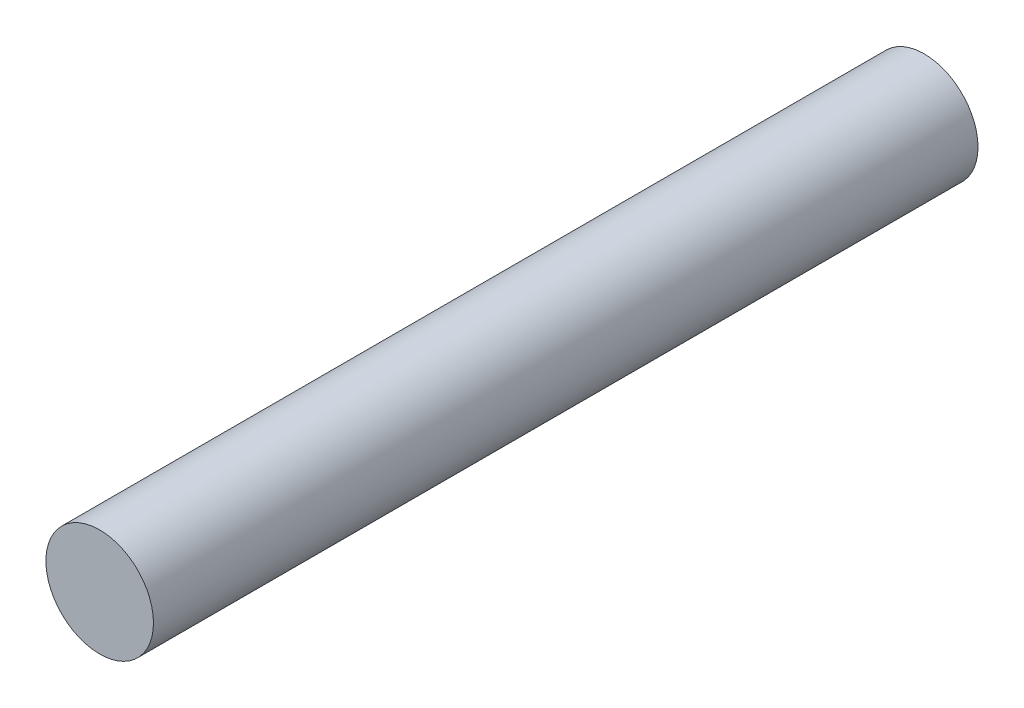
ISO-10303-21;
HEADER;
FILE_DESCRIPTION(('STEP AP214'),'2;1');
FILE_NAME('part.step','',(''),(''),'','','');
FILE_SCHEMA(('AUTOMOTIVE_DESIGN { 1 0 10303 214 1 1 1 1 }'));
ENDSEC;
DATA;
#1=APPLICATION_CONTEXT('core data for automotive mechanical design processes');
#2=APPLICATION_PROTOCOL_DEFINITION('international standard','automotive_design',2000,#1);
#3=PRODUCT_CONTEXT('',#1,'mechanical');
#4=PRODUCT('Part','Part','',(#3));
#5=PRODUCT_RELATED_PRODUCT_CATEGORY('part','',(#4));
#6=PRODUCT_DEFINITION_FORMATION('','',#4);
#7=PRODUCT_DEFINITION_CONTEXT('part definition',#1,'design');
#8=PRODUCT_DEFINITION('design','',#6,#7);
#9=PRODUCT_DEFINITION_SHAPE('','',#8);
#10=(LENGTH_UNIT() NAMED_UNIT(*) SI_UNIT(.MILLI.,.METRE.));
#11=(NAMED_UNIT(*) PLANE_ANGLE_UNIT() SI_UNIT($,.RADIAN.));
#12=(NAMED_UNIT(*) SI_UNIT($,.STERADIAN.) SOLID_ANGLE_UNIT());
#13=UNCERTAINTY_MEASURE_WITH_UNIT(LENGTH_MEASURE(1.E-05),#10,'distance_accuracy_value','');
#14=(GEOMETRIC_REPRESENTATION_CONTEXT(3) GLOBAL_UNCERTAINTY_ASSIGNED_CONTEXT((#13)) GLOBAL_UNIT_ASSIGNED_CONTEXT((#10,
#11,#12)) REPRESENTATION_CONTEXT('',''));
#15=CARTESIAN_POINT('',(0.,0.,0.));
#16=DIRECTION('',(0.,0.,1.));
#17=DIRECTION('',(1.,0.,0.));
#18=AXIS2_PLACEMENT_3D('',#15,#16,#17);
#19=CARTESIAN_POINT('',(0.,0.,23.));
#20=DIRECTION('',(0.,0.,-1.));
#21=DIRECTION('',(-1.,0.,0.));
#22=AXIS2_PLACEMENT_3D('',#19,#20,#21);
#23=CYLINDRICAL_SURFACE('',#22,1.5);
#24=CARTESIAN_POINT('',(0.,0.,23.));
#25=DIRECTION('',(0.,0.,1.));
#26=DIRECTION('',(1.,0.,0.));
#27=AXIS2_PLACEMENT_3D('',#24,#25,#26);
#28=CIRCLE('',#27,1.5);
#29=CARTESIAN_POINT('',(1.5,0.,23.));
#30=VERTEX_POINT('',#29);
#31=EDGE_CURVE('E10',#30,#30,#28,.T.);
#32=ORIENTED_EDGE('',*,*,#31,.F.);
#33=EDGE_LOOP('',(#32));
#34=FACE_BOUND('',#33,.T.);
#35=CARTESIAN_POINT('',(0.,0.,0.));
#36=DIRECTION('',(0.,0.,1.));
#37=DIRECTION('',(1.,0.,0.));
#38=AXIS2_PLACEMENT_3D('',#35,#36,#37);
#39=CIRCLE('',#38,1.5);
#40=CARTESIAN_POINT('',(1.5,0.,0.));
#41=VERTEX_POINT('',#40);
#42=EDGE_CURVE('E40',#41,#41,#39,.T.);
#43=ORIENTED_EDGE('',*,*,#42,.T.);
#44=EDGE_LOOP('',(#43));
#45=FACE_BOUND('',#44,.T.);
#46=ADVANCED_FACE('F37',(#34,#45),#23,.T.);
#47=CARTESIAN_POINT('',(0.,0.,23.));
#48=DIRECTION('',(0.,0.,1.));
#49=DIRECTION('',(1.,0.,0.));
#50=AXIS2_PLACEMENT_3D('',#47,#48,#49);
#51=PLANE('',#50);
#52=ORIENTED_EDGE('',*,*,#31,.T.);
#53=EDGE_LOOP('',(#52));
#54=FACE_BOUND('',#53,.T.);
#55=ADVANCED_FACE('F54',(#54),#51,.T.);
#56=CARTESIAN_POINT('',(0.,0.,0.));
#57=DIRECTION('',(0.,0.,1.));
#58=DIRECTION('',(1.,0.,0.));
#59=AXIS2_PLACEMENT_3D('',#56,#57,#58);
#60=PLANE('',#59);
#61=ORIENTED_EDGE('',*,*,#42,.F.);
#62=EDGE_LOOP('',(#61));
#63=FACE_BOUND('',#62,.T.);
#64=ADVANCED_FACE('F52',(#63),#60,.F.);
#65=CLOSED_SHELL('',(#46,#55,#64));
#66=MANIFOLD_SOLID_BREP('B2',#65);
#67=ADVANCED_BREP_SHAPE_REPRESENTATION('',(#18,#66),#14);
#68=SHAPE_DEFINITION_REPRESENTATION(#9,#67);
ENDSEC;
END-ISO-10303-21;
